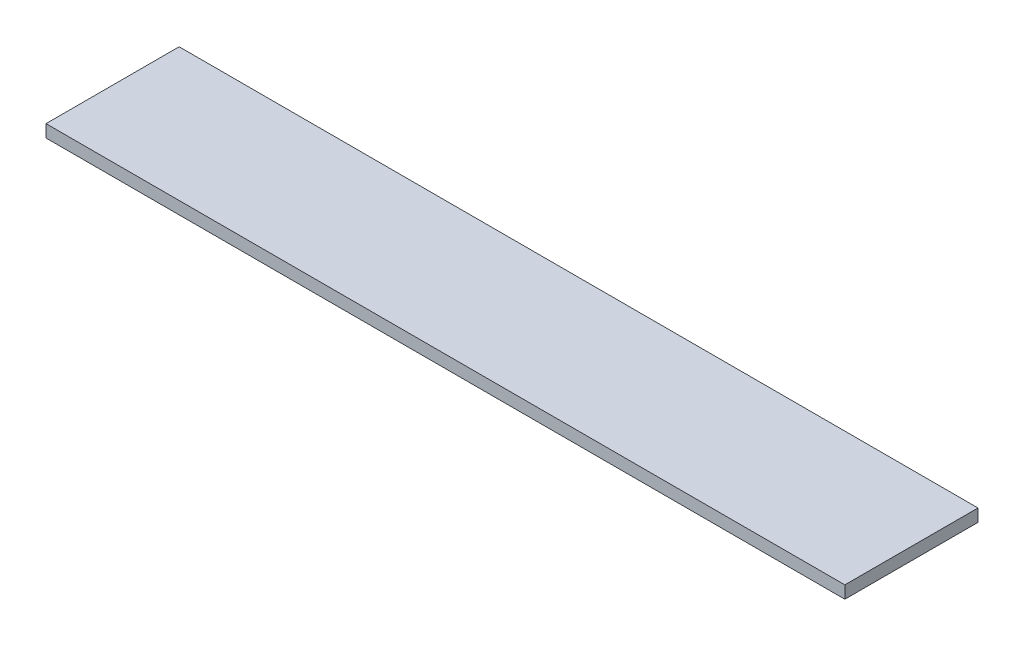
ISO-10303-21;
HEADER;
FILE_DESCRIPTION(('STEP AP214'),'2;1');
FILE_NAME('part.step','',(''),(''),'','','');
FILE_SCHEMA(('AUTOMOTIVE_DESIGN { 1 0 10303 214 1 1 1 1 }'));
ENDSEC;
DATA;
#1=APPLICATION_CONTEXT('core data for automotive mechanical design processes');
#2=APPLICATION_PROTOCOL_DEFINITION('international standard','automotive_design',2000,#1);
#3=PRODUCT_CONTEXT('',#1,'mechanical');
#4=PRODUCT('Part','Part','',(#3));
#5=PRODUCT_RELATED_PRODUCT_CATEGORY('part','',(#4));
#6=PRODUCT_DEFINITION_FORMATION('','',#4);
#7=PRODUCT_DEFINITION_CONTEXT('part definition',#1,'design');
#8=PRODUCT_DEFINITION('design','',#6,#7);
#9=PRODUCT_DEFINITION_SHAPE('','',#8);
#10=(LENGTH_UNIT() NAMED_UNIT(*) SI_UNIT(.MILLI.,.METRE.));
#11=(NAMED_UNIT(*) PLANE_ANGLE_UNIT() SI_UNIT($,.RADIAN.));
#12=(NAMED_UNIT(*) SI_UNIT($,.STERADIAN.) SOLID_ANGLE_UNIT());
#13=UNCERTAINTY_MEASURE_WITH_UNIT(LENGTH_MEASURE(1.E-05),#10,'distance_accuracy_value','');
#14=(GEOMETRIC_REPRESENTATION_CONTEXT(3) GLOBAL_UNCERTAINTY_ASSIGNED_CONTEXT((#13)) GLOBAL_UNIT_ASSIGNED_CONTEXT((#10,
#11,#12)) REPRESENTATION_CONTEXT('',''));
#15=CARTESIAN_POINT('',(0.,0.,0.));
#16=DIRECTION('',(0.,0.,1.));
#17=DIRECTION('',(1.,0.,0.));
#18=AXIS2_PLACEMENT_3D('',#15,#16,#17);
#19=CARTESIAN_POINT('',(609.6,19.05,-101.6));
#20=DIRECTION('',(-1.,0.,0.));
#21=DIRECTION('',(0.,0.,1.));
#22=AXIS2_PLACEMENT_3D('',#19,#20,#21);
#23=PLANE('',#22);
#24=DIRECTION('',(0.,0.,-1.));
#25=VECTOR('',#24,1.);
#26=CARTESIAN_POINT('',(609.6,0.,-101.6));
#27=LINE('',#26,#25);
#28=CARTESIAN_POINT('',(609.6,0.,101.6));
#29=VERTEX_POINT('',#28);
#30=CARTESIAN_POINT('',(609.6,0.,-101.6));
#31=VERTEX_POINT('',#30);
#32=EDGE_CURVE('E113',#29,#31,#27,.T.);
#33=ORIENTED_EDGE('',*,*,#32,.T.);
#34=DIRECTION('',(0.,-1.,0.));
#35=VECTOR('',#34,1.);
#36=CARTESIAN_POINT('',(609.6,19.05,-101.6));
#37=LINE('',#36,#35);
#38=CARTESIAN_POINT('',(609.6,19.05,-101.6));
#39=VERTEX_POINT('',#38);
#40=EDGE_CURVE('E11',#39,#31,#37,.T.);
#41=ORIENTED_EDGE('',*,*,#40,.F.);
#42=DIRECTION('',(0.,0.,-1.));
#43=VECTOR('',#42,1.);
#44=CARTESIAN_POINT('',(609.6,19.05,-101.6));
#45=LINE('',#44,#43);
#46=CARTESIAN_POINT('',(609.6,19.05,101.6));
#47=VERTEX_POINT('',#46);
#48=EDGE_CURVE('E97',#47,#39,#45,.T.);
#49=ORIENTED_EDGE('',*,*,#48,.F.);
#50=DIRECTION('',(0.,-1.,0.));
#51=VECTOR('',#50,1.);
#52=CARTESIAN_POINT('',(609.6,19.05,101.6));
#53=LINE('',#52,#51);
#54=EDGE_CURVE('E109',#47,#29,#53,.T.);
#55=ORIENTED_EDGE('',*,*,#54,.T.);
#56=EDGE_LOOP('',(#33,#41,#49,#55));
#57=FACE_BOUND('',#56,.T.);
#58=ADVANCED_FACE('F45',(#57),#23,.F.);
#59=CARTESIAN_POINT('',(-609.6,19.05,-101.6));
#60=DIRECTION('',(0.,0.,1.));
#61=DIRECTION('',(1.,0.,0.));
#62=AXIS2_PLACEMENT_3D('',#59,#60,#61);
#63=PLANE('',#62);
#64=DIRECTION('',(-1.,0.,0.));
#65=VECTOR('',#64,1.);
#66=CARTESIAN_POINT('',(-609.6,0.,-101.6));
#67=LINE('',#66,#65);
#68=CARTESIAN_POINT('',(-609.6,0.,-101.6));
#69=VERTEX_POINT('',#68);
#70=EDGE_CURVE('E102',#31,#69,#67,.T.);
#71=ORIENTED_EDGE('',*,*,#70,.T.);
#72=DIRECTION('',(0.,-1.,0.));
#73=VECTOR('',#72,1.);
#74=CARTESIAN_POINT('',(-609.6,19.05,-101.6));
#75=LINE('',#74,#73);
#76=CARTESIAN_POINT('',(-609.6,19.05,-101.6));
#77=VERTEX_POINT('',#76);
#78=EDGE_CURVE('E54',#77,#69,#75,.T.);
#79=ORIENTED_EDGE('',*,*,#78,.F.);
#80=DIRECTION('',(-1.,0.,0.));
#81=VECTOR('',#80,1.);
#82=CARTESIAN_POINT('',(-609.6,19.05,-101.6));
#83=LINE('',#82,#81);
#84=EDGE_CURVE('E92',#39,#77,#83,.T.);
#85=ORIENTED_EDGE('',*,*,#84,.F.);
#86=ORIENTED_EDGE('',*,*,#40,.T.);
#87=EDGE_LOOP('',(#71,#79,#85,#86));
#88=FACE_BOUND('',#87,.T.);
#89=ADVANCED_FACE('F101',(#88),#63,.F.);
#90=CARTESIAN_POINT('',(-609.6,19.05,-101.6));
#91=DIRECTION('',(1.,0.,0.));
#92=DIRECTION('',(0.,0.,-1.));
#93=AXIS2_PLACEMENT_3D('',#90,#91,#92);
#94=PLANE('',#93);
#95=DIRECTION('',(0.,0.,1.));
#96=VECTOR('',#95,1.);
#97=CARTESIAN_POINT('',(-609.6,0.,-101.6));
#98=LINE('',#97,#96);
#99=CARTESIAN_POINT('',(-609.6,0.,101.6));
#100=VERTEX_POINT('',#99);
#101=EDGE_CURVE('E79',#69,#100,#98,.T.);
#102=ORIENTED_EDGE('',*,*,#101,.T.);
#103=DIRECTION('',(0.,-1.,0.));
#104=VECTOR('',#103,1.);
#105=CARTESIAN_POINT('',(-609.6,19.05,101.6));
#106=LINE('',#105,#104);
#107=CARTESIAN_POINT('',(-609.6,19.05,101.6));
#108=VERTEX_POINT('',#107);
#109=EDGE_CURVE('E104',#108,#100,#106,.T.);
#110=ORIENTED_EDGE('',*,*,#109,.F.);
#111=DIRECTION('',(0.,0.,1.));
#112=VECTOR('',#111,1.);
#113=CARTESIAN_POINT('',(-609.6,19.05,-101.6));
#114=LINE('',#113,#112);
#115=EDGE_CURVE('E95',#77,#108,#114,.T.);
#116=ORIENTED_EDGE('',*,*,#115,.F.);
#117=ORIENTED_EDGE('',*,*,#78,.T.);
#118=EDGE_LOOP('',(#102,#110,#116,#117));
#119=FACE_BOUND('',#118,.T.);
#120=ADVANCED_FACE('F105',(#119),#94,.F.);
#121=CARTESIAN_POINT('',(-609.6,19.05,101.6));
#122=DIRECTION('',(0.,0.,-1.));
#123=DIRECTION('',(-1.,0.,0.));
#124=AXIS2_PLACEMENT_3D('',#121,#122,#123);
#125=PLANE('',#124);
#126=DIRECTION('',(1.,0.,0.));
#127=VECTOR('',#126,1.);
#128=CARTESIAN_POINT('',(-609.6,0.,101.6));
#129=LINE('',#128,#127);
#130=EDGE_CURVE('E85',#100,#29,#129,.T.);
#131=ORIENTED_EDGE('',*,*,#130,.T.);
#132=ORIENTED_EDGE('',*,*,#54,.F.);
#133=DIRECTION('',(1.,0.,0.));
#134=VECTOR('',#133,1.);
#135=CARTESIAN_POINT('',(-609.6,19.05,101.6));
#136=LINE('',#135,#134);
#137=EDGE_CURVE('E62',#108,#47,#136,.T.);
#138=ORIENTED_EDGE('',*,*,#137,.F.);
#139=ORIENTED_EDGE('',*,*,#109,.T.);
#140=EDGE_LOOP('',(#131,#132,#138,#139));
#141=FACE_BOUND('',#140,.T.);
#142=ADVANCED_FACE('F126',(#141),#125,.F.);
#143=CARTESIAN_POINT('',(0.,19.05,0.));
#144=DIRECTION('',(0.,1.,0.));
#145=DIRECTION('',(0.,0.,1.));
#146=AXIS2_PLACEMENT_3D('',#143,#144,#145);
#147=PLANE('',#146);
#148=ORIENTED_EDGE('',*,*,#48,.T.);
#149=ORIENTED_EDGE('',*,*,#84,.T.);
#150=ORIENTED_EDGE('',*,*,#115,.T.);
#151=ORIENTED_EDGE('',*,*,#137,.T.);
#152=EDGE_LOOP('',(#148,#149,#150,#151));
#153=FACE_BOUND('',#152,.T.);
#154=ADVANCED_FACE('F93',(#153),#147,.T.);
#155=CARTESIAN_POINT('',(0.,0.,0.));
#156=DIRECTION('',(0.,1.,0.));
#157=DIRECTION('',(0.,0.,1.));
#158=AXIS2_PLACEMENT_3D('',#155,#156,#157);
#159=PLANE('',#158);
#160=ORIENTED_EDGE('',*,*,#32,.F.);
#161=ORIENTED_EDGE('',*,*,#130,.F.);
#162=ORIENTED_EDGE('',*,*,#101,.F.);
#163=ORIENTED_EDGE('',*,*,#70,.F.);
#164=EDGE_LOOP('',(#160,#161,#162,#163));
#165=FACE_BOUND('',#164,.T.);
#166=ADVANCED_FACE('F129',(#165),#159,.F.);
#167=CLOSED_SHELL('',(#58,#89,#120,#142,#154,#166));
#168=MANIFOLD_SOLID_BREP('B2',#167);
#169=ADVANCED_BREP_SHAPE_REPRESENTATION('',(#18,#168),#14);
#170=SHAPE_DEFINITION_REPRESENTATION(#9,#169);
ENDSEC;
END-ISO-10303-21;
